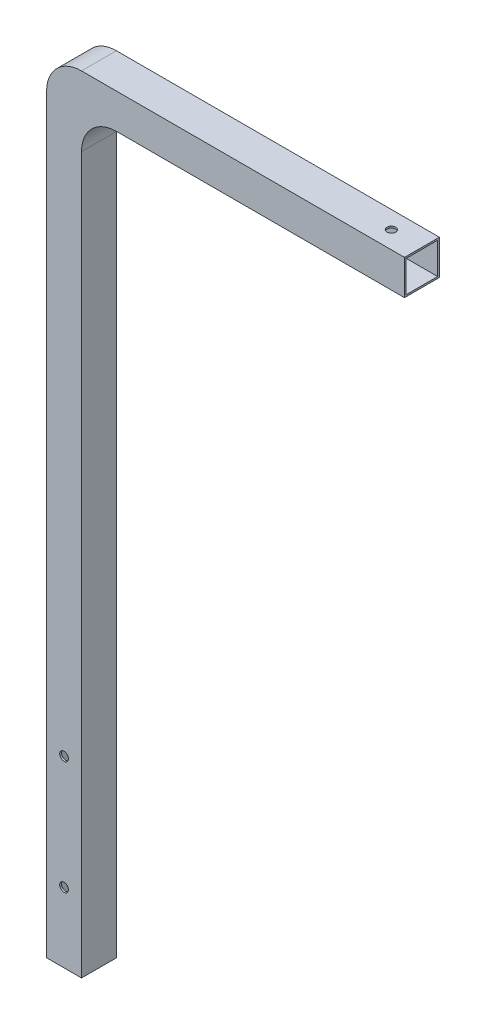
ISO-10303-21;
HEADER;
FILE_DESCRIPTION(('STEP AP214'),'2;1');
FILE_NAME('part.step','',(''),(''),'','','');
FILE_SCHEMA(('AUTOMOTIVE_DESIGN { 1 0 10303 214 1 1 1 1 }'));
ENDSEC;
DATA;
#1=APPLICATION_CONTEXT('core data for automotive mechanical design processes');
#2=APPLICATION_PROTOCOL_DEFINITION('international standard','automotive_design',2000,#1);
#3=PRODUCT_CONTEXT('',#1,'mechanical');
#4=PRODUCT('Part','Part','',(#3));
#5=PRODUCT_RELATED_PRODUCT_CATEGORY('part','',(#4));
#6=PRODUCT_DEFINITION_FORMATION('','',#4);
#7=PRODUCT_DEFINITION_CONTEXT('part definition',#1,'design');
#8=PRODUCT_DEFINITION('design','',#6,#7);
#9=PRODUCT_DEFINITION_SHAPE('','',#8);
#10=(LENGTH_UNIT() NAMED_UNIT(*) SI_UNIT(.MILLI.,.METRE.));
#11=(NAMED_UNIT(*) PLANE_ANGLE_UNIT() SI_UNIT($,.RADIAN.));
#12=(NAMED_UNIT(*) SI_UNIT($,.STERADIAN.) SOLID_ANGLE_UNIT());
#13=UNCERTAINTY_MEASURE_WITH_UNIT(LENGTH_MEASURE(1.E-05),#10,'distance_accuracy_value','');
#14=(GEOMETRIC_REPRESENTATION_CONTEXT(3) GLOBAL_UNCERTAINTY_ASSIGNED_CONTEXT((#13)) GLOBAL_UNIT_ASSIGNED_CONTEXT((#10,
#11,#12)) REPRESENTATION_CONTEXT('',''));
#15=CARTESIAN_POINT('',(0.,0.,0.));
#16=DIRECTION('',(0.,0.,1.));
#17=DIRECTION('',(1.,0.,0.));
#18=AXIS2_PLACEMENT_3D('',#15,#16,#17);
#19=CARTESIAN_POINT('',(520.7,1143.,50.8));
#20=DIRECTION('',(-1.,0.,0.));
#21=DIRECTION('',(0.,0.,1.));
#22=AXIS2_PLACEMENT_3D('',#19,#20,#21);
#23=PLANE('',#22);
#24=DIRECTION('',(0.,1.,0.));
#25=VECTOR('',#24,1.);
#26=CARTESIAN_POINT('',(520.7,1143.,0.));
#27=LINE('',#26,#25);
#28=CARTESIAN_POINT('',(520.7,1092.2,0.));
#29=VERTEX_POINT('',#28);
#30=CARTESIAN_POINT('',(520.7,1143.,0.));
#31=VERTEX_POINT('',#30);
#32=EDGE_CURVE('E281',#29,#31,#27,.T.);
#33=ORIENTED_EDGE('',*,*,#32,.T.);
#34=DIRECTION('',(0.,0.,-1.));
#35=VECTOR('',#34,1.);
#36=CARTESIAN_POINT('',(520.7,1143.,50.8));
#37=LINE('',#36,#35);
#38=CARTESIAN_POINT('',(520.7,1143.,50.8));
#39=VERTEX_POINT('',#38);
#40=EDGE_CURVE('E293',#39,#31,#37,.T.);
#41=ORIENTED_EDGE('',*,*,#40,.F.);
#42=DIRECTION('',(0.,1.,0.));
#43=VECTOR('',#42,1.);
#44=CARTESIAN_POINT('',(520.7,1143.,50.8));
#45=LINE('',#44,#43);
#46=CARTESIAN_POINT('',(520.7,1092.2,50.8));
#47=VERTEX_POINT('',#46);
#48=EDGE_CURVE('E260',#47,#39,#45,.T.);
#49=ORIENTED_EDGE('',*,*,#48,.F.);
#50=DIRECTION('',(0.,0.,-1.));
#51=VECTOR('',#50,1.);
#52=CARTESIAN_POINT('',(520.7,1092.2,50.8));
#53=LINE('',#52,#51);
#54=EDGE_CURVE('E297',#47,#29,#53,.T.);
#55=ORIENTED_EDGE('',*,*,#54,.T.);
#56=EDGE_LOOP('',(#33,#41,#49,#55));
#57=FACE_BOUND('',#56,.T.);
#58=DIRECTION('',(0.,1.,0.));
#59=VECTOR('',#58,1.);
#60=CARTESIAN_POINT('',(520.7,1143.,2.54));
#61=LINE('',#60,#59);
#62=CARTESIAN_POINT('',(520.7,1094.74,2.54));
#63=VERTEX_POINT('',#62);
#64=CARTESIAN_POINT('',(520.7,1140.46,2.54));
#65=VERTEX_POINT('',#64);
#66=EDGE_CURVE('E221',#63,#65,#61,.T.);
#67=ORIENTED_EDGE('',*,*,#66,.F.);
#68=DIRECTION('',(0.,0.,-1.));
#69=VECTOR('',#68,1.);
#70=CARTESIAN_POINT('',(520.7,1094.74,50.8));
#71=LINE('',#70,#69);
#72=CARTESIAN_POINT('',(520.7,1094.74,48.26));
#73=VERTEX_POINT('',#72);
#74=EDGE_CURVE('E218',#73,#63,#71,.T.);
#75=ORIENTED_EDGE('',*,*,#74,.F.);
#76=DIRECTION('',(0.,1.,0.));
#77=VECTOR('',#76,1.);
#78=CARTESIAN_POINT('',(520.7,1143.,48.26));
#79=LINE('',#78,#77);
#80=CARTESIAN_POINT('',(520.7,1140.46,48.26));
#81=VERTEX_POINT('',#80);
#82=EDGE_CURVE('E63',#73,#81,#79,.T.);
#83=ORIENTED_EDGE('',*,*,#82,.T.);
#84=DIRECTION('',(0.,0.,-1.));
#85=VECTOR('',#84,1.);
#86=CARTESIAN_POINT('',(520.7,1140.46,50.8));
#87=LINE('',#86,#85);
#88=EDGE_CURVE('E166',#81,#65,#87,.T.);
#89=ORIENTED_EDGE('',*,*,#88,.T.);
#90=EDGE_LOOP('',(#67,#75,#83,#89));
#91=FACE_BOUND('',#90,.T.);
#92=ADVANCED_FACE('F38',(#57,#91),#23,.F.);
#93=CARTESIAN_POINT('',(0.,0.,50.8));
#94=DIRECTION('',(0.,1.,0.));
#95=DIRECTION('',(0.,0.,1.));
#96=AXIS2_PLACEMENT_3D('',#93,#94,#95);
#97=PLANE('',#96);
#98=DIRECTION('',(-1.,0.,0.));
#99=VECTOR('',#98,1.);
#100=CARTESIAN_POINT('',(48.26,0.,48.26));
#101=LINE('',#100,#99);
#102=CARTESIAN_POINT('',(48.26,0.,48.26));
#103=VERTEX_POINT('',#102);
#104=CARTESIAN_POINT('',(2.54,0.,48.26));
#105=VERTEX_POINT('',#104);
#106=EDGE_CURVE('E170',#103,#105,#101,.T.);
#107=ORIENTED_EDGE('',*,*,#106,.F.);
#108=DIRECTION('',(0.,0.,1.));
#109=VECTOR('',#108,1.);
#110=CARTESIAN_POINT('',(48.26,0.,2.54));
#111=LINE('',#110,#109);
#112=CARTESIAN_POINT('',(48.26,0.,2.54));
#113=VERTEX_POINT('',#112);
#114=EDGE_CURVE('E175',#113,#103,#111,.T.);
#115=ORIENTED_EDGE('',*,*,#114,.F.);
#116=DIRECTION('',(1.,0.,0.));
#117=VECTOR('',#116,1.);
#118=CARTESIAN_POINT('',(2.54,0.,2.54));
#119=LINE('',#118,#117);
#120=CARTESIAN_POINT('',(2.54,0.,2.54));
#121=VERTEX_POINT('',#120);
#122=EDGE_CURVE('E180',#121,#113,#119,.T.);
#123=ORIENTED_EDGE('',*,*,#122,.F.);
#124=DIRECTION('',(0.,0.,-1.));
#125=VECTOR('',#124,1.);
#126=CARTESIAN_POINT('',(2.54,0.,48.26));
#127=LINE('',#126,#125);
#128=EDGE_CURVE('E160',#105,#121,#127,.T.);
#129=ORIENTED_EDGE('',*,*,#128,.F.);
#130=EDGE_LOOP('',(#107,#115,#123,#129));
#131=FACE_BOUND('',#130,.T.);
#132=DIRECTION('',(1.,0.,0.));
#133=VECTOR('',#132,1.);
#134=CARTESIAN_POINT('',(0.,0.,0.));
#135=LINE('',#134,#133);
#136=CARTESIAN_POINT('',(0.,0.,0.));
#137=VERTEX_POINT('',#136);
#138=CARTESIAN_POINT('',(50.8,0.,0.));
#139=VERTEX_POINT('',#138);
#140=EDGE_CURVE('E212',#137,#139,#135,.T.);
#141=ORIENTED_EDGE('',*,*,#140,.T.);
#142=DIRECTION('',(0.,0.,-1.));
#143=VECTOR('',#142,1.);
#144=CARTESIAN_POINT('',(50.8,0.,50.8));
#145=LINE('',#144,#143);
#146=CARTESIAN_POINT('',(50.8,0.,50.8));
#147=VERTEX_POINT('',#146);
#148=EDGE_CURVE('E301',#147,#139,#145,.T.);
#149=ORIENTED_EDGE('',*,*,#148,.F.);
#150=DIRECTION('',(1.,0.,0.));
#151=VECTOR('',#150,1.);
#152=CARTESIAN_POINT('',(0.,0.,50.8));
#153=LINE('',#152,#151);
#154=CARTESIAN_POINT('',(0.,0.,50.8));
#155=VERTEX_POINT('',#154);
#156=EDGE_CURVE('E248',#155,#147,#153,.T.);
#157=ORIENTED_EDGE('',*,*,#156,.F.);
#158=DIRECTION('',(0.,0.,-1.));
#159=VECTOR('',#158,1.);
#160=CARTESIAN_POINT('',(0.,0.,50.8));
#161=LINE('',#160,#159);
#162=EDGE_CURVE('E270',#155,#137,#161,.T.);
#163=ORIENTED_EDGE('',*,*,#162,.T.);
#164=EDGE_LOOP('',(#141,#149,#157,#163));
#165=FACE_BOUND('',#164,.T.);
#166=ADVANCED_FACE('F177',(#131,#165),#97,.F.);
#167=CARTESIAN_POINT('',(50.8,0.,50.8));
#168=DIRECTION('',(-1.,0.,0.));
#169=DIRECTION('',(0.,0.,1.));
#170=AXIS2_PLACEMENT_3D('',#167,#168,#169);
#171=PLANE('',#170);
#172=DIRECTION('',(0.,1.,0.));
#173=VECTOR('',#172,1.);
#174=CARTESIAN_POINT('',(50.8,0.,0.));
#175=LINE('',#174,#173);
#176=CARTESIAN_POINT('',(50.8,1041.4,0.));
#177=VERTEX_POINT('',#176);
#178=EDGE_CURVE('E274',#139,#177,#175,.T.);
#179=ORIENTED_EDGE('',*,*,#178,.T.);
#180=DIRECTION('',(0.,0.,-1.));
#181=VECTOR('',#180,1.);
#182=CARTESIAN_POINT('',(50.8,1041.4,50.8));
#183=LINE('',#182,#181);
#184=CARTESIAN_POINT('',(50.8,1041.4,50.8));
#185=VERTEX_POINT('',#184);
#186=EDGE_CURVE('E309',#177,#185,#183,.F.);
#187=ORIENTED_EDGE('',*,*,#186,.T.);
#188=DIRECTION('',(0.,1.,0.));
#189=VECTOR('',#188,1.);
#190=CARTESIAN_POINT('',(50.8,0.,50.8));
#191=LINE('',#190,#189);
#192=EDGE_CURVE('E252',#147,#185,#191,.T.);
#193=ORIENTED_EDGE('',*,*,#192,.F.);
#194=ORIENTED_EDGE('',*,*,#148,.T.);
#195=EDGE_LOOP('',(#179,#187,#193,#194));
#196=FACE_BOUND('',#195,.T.);
#197=ADVANCED_FACE('F404',(#196),#171,.F.);
#198=CARTESIAN_POINT('',(50.8,1092.2,50.8));
#199=DIRECTION('',(0.,1.,0.));
#200=DIRECTION('',(0.,0.,1.));
#201=AXIS2_PLACEMENT_3D('',#198,#199,#200);
#202=PLANE('',#201);
#203=CARTESIAN_POINT('',(476.25,1092.2,25.4));
#204=DIRECTION('',(0.,1.,0.));
#205=DIRECTION('',(0.,0.,1.));
#206=AXIS2_PLACEMENT_3D('',#203,#204,#205);
#207=CIRCLE('',#206,6.34999999999991);
#208=CARTESIAN_POINT('',(476.25,1092.2,31.7499999999999));
#209=VERTEX_POINT('',#208);
#210=EDGE_CURVE('E362',#209,#209,#207,.T.);
#211=ORIENTED_EDGE('',*,*,#210,.T.);
#212=EDGE_LOOP('',(#211));
#213=FACE_BOUND('',#212,.T.);
#214=DIRECTION('',(1.,0.,0.));
#215=VECTOR('',#214,1.);
#216=CARTESIAN_POINT('',(50.8,1092.2,50.8));
#217=LINE('',#216,#215);
#218=CARTESIAN_POINT('',(101.6,1092.2,50.8));
#219=VERTEX_POINT('',#218);
#220=EDGE_CURVE('E257',#219,#47,#217,.T.);
#221=ORIENTED_EDGE('',*,*,#220,.F.);
#222=DIRECTION('',(0.,0.,-1.));
#223=VECTOR('',#222,1.);
#224=CARTESIAN_POINT('',(101.6,1092.2,0.));
#225=LINE('',#224,#223);
#226=CARTESIAN_POINT('',(101.6,1092.2,0.));
#227=VERTEX_POINT('',#226);
#228=EDGE_CURVE('E305',#219,#227,#225,.T.);
#229=ORIENTED_EDGE('',*,*,#228,.T.);
#230=DIRECTION('',(1.,0.,0.));
#231=VECTOR('',#230,1.);
#232=CARTESIAN_POINT('',(50.8,1092.2,0.));
#233=LINE('',#232,#231);
#234=EDGE_CURVE('E278',#227,#29,#233,.T.);
#235=ORIENTED_EDGE('',*,*,#234,.T.);
#236=ORIENTED_EDGE('',*,*,#54,.F.);
#237=EDGE_LOOP('',(#221,#229,#235,#236));
#238=FACE_BOUND('',#237,.T.);
#239=ADVANCED_FACE('F410',(#213,#238),#202,.F.);
#240=CARTESIAN_POINT('',(0.,1143.,50.8));
#241=DIRECTION('',(0.,-1.,0.));
#242=DIRECTION('',(0.,0.,-1.));
#243=AXIS2_PLACEMENT_3D('',#240,#241,#242);
#244=PLANE('',#243);
#245=CARTESIAN_POINT('',(476.25,1143.,25.4));
#246=DIRECTION('',(0.,1.,0.));
#247=DIRECTION('',(0.,0.,1.));
#248=AXIS2_PLACEMENT_3D('',#245,#246,#247);
#249=CIRCLE('',#248,6.34999999999997);
#250=CARTESIAN_POINT('',(476.25,1143.,31.75));
#251=VERTEX_POINT('',#250);
#252=EDGE_CURVE('E331',#251,#251,#249,.T.);
#253=ORIENTED_EDGE('',*,*,#252,.F.);
#254=EDGE_LOOP('',(#253));
#255=FACE_BOUND('',#254,.T.);
#256=DIRECTION('',(-1.,0.,0.));
#257=VECTOR('',#256,1.);
#258=CARTESIAN_POINT('',(0.,1143.,0.));
#259=LINE('',#258,#257);
#260=CARTESIAN_POINT('',(50.8,1143.,0.));
#261=VERTEX_POINT('',#260);
#262=EDGE_CURVE('E284',#31,#261,#259,.T.);
#263=ORIENTED_EDGE('',*,*,#262,.T.);
#264=DIRECTION('',(0.,0.,-1.));
#265=VECTOR('',#264,1.);
#266=CARTESIAN_POINT('',(50.8,1143.,50.8));
#267=LINE('',#266,#265);
#268=CARTESIAN_POINT('',(50.8,1143.,50.8));
#269=VERTEX_POINT('',#268);
#270=EDGE_CURVE('E319',#261,#269,#267,.F.);
#271=ORIENTED_EDGE('',*,*,#270,.T.);
#272=DIRECTION('',(-1.,0.,0.));
#273=VECTOR('',#272,1.);
#274=CARTESIAN_POINT('',(0.,1143.,50.8));
#275=LINE('',#274,#273);
#276=EDGE_CURVE('E263',#39,#269,#275,.T.);
#277=ORIENTED_EDGE('',*,*,#276,.F.);
#278=ORIENTED_EDGE('',*,*,#40,.T.);
#279=EDGE_LOOP('',(#263,#271,#277,#278));
#280=FACE_BOUND('',#279,.T.);
#281=ADVANCED_FACE('F408',(#255,#280),#244,.F.);
#282=CARTESIAN_POINT('',(0.,0.,50.8));
#283=DIRECTION('',(1.,0.,0.));
#284=DIRECTION('',(0.,0.,-1.));
#285=AXIS2_PLACEMENT_3D('',#282,#283,#284);
#286=PLANE('',#285);
#287=DIRECTION('',(0.,-1.,0.));
#288=VECTOR('',#287,1.);
#289=CARTESIAN_POINT('',(0.,0.,50.8));
#290=LINE('',#289,#288);
#291=CARTESIAN_POINT('',(0.,1092.2,50.8));
#292=VERTEX_POINT('',#291);
#293=EDGE_CURVE('E267',#292,#155,#290,.T.);
#294=ORIENTED_EDGE('',*,*,#293,.F.);
#295=DIRECTION('',(0.,0.,-1.));
#296=VECTOR('',#295,1.);
#297=CARTESIAN_POINT('',(0.,1092.2,50.8));
#298=LINE('',#297,#296);
#299=CARTESIAN_POINT('',(0.,1092.2,0.));
#300=VERTEX_POINT('',#299);
#301=EDGE_CURVE('E312',#292,#300,#298,.T.);
#302=ORIENTED_EDGE('',*,*,#301,.T.);
#303=DIRECTION('',(0.,-1.,0.));
#304=VECTOR('',#303,1.);
#305=CARTESIAN_POINT('',(0.,0.,0.));
#306=LINE('',#305,#304);
#307=EDGE_CURVE('E253',#300,#137,#306,.T.);
#308=ORIENTED_EDGE('',*,*,#307,.T.);
#309=ORIENTED_EDGE('',*,*,#162,.F.);
#310=EDGE_LOOP('',(#294,#302,#308,#309));
#311=FACE_BOUND('',#310,.T.);
#312=ADVANCED_FACE('F447',(#311),#286,.F.);
#313=CARTESIAN_POINT('',(0.,0.,50.8));
#314=DIRECTION('',(0.,0.,1.));
#315=DIRECTION('',(1.,0.,0.));
#316=AXIS2_PLACEMENT_3D('',#313,#314,#315);
#317=PLANE('',#316);
#318=CARTESIAN_POINT('',(25.4,101.6,50.8));
#319=DIRECTION('',(0.,0.,1.));
#320=DIRECTION('',(1.,0.,0.));
#321=AXIS2_PLACEMENT_3D('',#318,#319,#320);
#322=CIRCLE('',#321,6.34999999999999);
#323=CARTESIAN_POINT('',(31.75,101.6,50.8));
#324=VERTEX_POINT('',#323);
#325=EDGE_CURVE('E691',#324,#324,#322,.T.);
#326=ORIENTED_EDGE('',*,*,#325,.F.);
#327=EDGE_LOOP('',(#326));
#328=FACE_BOUND('',#327,.T.);
#329=CARTESIAN_POINT('',(25.4,266.7,50.8));
#330=DIRECTION('',(0.,0.,1.));
#331=DIRECTION('',(1.,0.,0.));
#332=AXIS2_PLACEMENT_3D('',#329,#330,#331);
#333=CIRCLE('',#332,6.34999999999999);
#334=CARTESIAN_POINT('',(31.75,266.7,50.8));
#335=VERTEX_POINT('',#334);
#336=EDGE_CURVE('E345',#335,#335,#333,.T.);
#337=ORIENTED_EDGE('',*,*,#336,.F.);
#338=EDGE_LOOP('',(#337));
#339=FACE_BOUND('',#338,.T.);
#340=ORIENTED_EDGE('',*,*,#276,.T.);
#341=CARTESIAN_POINT('',(50.8,1092.2,50.8));
#342=DIRECTION('',(0.,0.,1.));
#343=DIRECTION('',(1.,0.,0.));
#344=AXIS2_PLACEMENT_3D('',#341,#342,#343);
#345=CIRCLE('',#344,50.8);
#346=EDGE_CURVE('E322',#269,#292,#345,.T.);
#347=ORIENTED_EDGE('',*,*,#346,.T.);
#348=ORIENTED_EDGE('',*,*,#293,.T.);
#349=ORIENTED_EDGE('',*,*,#156,.T.);
#350=ORIENTED_EDGE('',*,*,#192,.T.);
#351=CARTESIAN_POINT('',(101.6,1041.4,50.8));
#352=DIRECTION('',(0.,0.,1.));
#353=DIRECTION('',(1.,0.,0.));
#354=AXIS2_PLACEMENT_3D('',#351,#352,#353);
#355=CIRCLE('',#354,50.8);
#356=EDGE_CURVE('E11',#185,#219,#355,.F.);
#357=ORIENTED_EDGE('',*,*,#356,.T.);
#358=ORIENTED_EDGE('',*,*,#220,.T.);
#359=ORIENTED_EDGE('',*,*,#48,.T.);
#360=EDGE_LOOP('',(#340,#347,#348,#349,#350,#357,#358,#359));
#361=FACE_BOUND('',#360,.T.);
#362=ADVANCED_FACE('F425',(#328,#339,#361),#317,.T.);
#363=CARTESIAN_POINT('',(0.,0.,0.));
#364=DIRECTION('',(0.,0.,1.));
#365=DIRECTION('',(1.,0.,0.));
#366=AXIS2_PLACEMENT_3D('',#363,#364,#365);
#367=PLANE('',#366);
#368=CARTESIAN_POINT('',(25.4,101.6,0.));
#369=DIRECTION('',(0.,0.,1.));
#370=DIRECTION('',(1.,0.,0.));
#371=AXIS2_PLACEMENT_3D('',#368,#369,#370);
#372=CIRCLE('',#371,6.34999999999999);
#373=CARTESIAN_POINT('',(31.75,101.6,0.));
#374=VERTEX_POINT('',#373);
#375=EDGE_CURVE('E697',#374,#374,#372,.T.);
#376=ORIENTED_EDGE('',*,*,#375,.T.);
#377=EDGE_LOOP('',(#376));
#378=FACE_BOUND('',#377,.T.);
#379=CARTESIAN_POINT('',(25.4,266.7,0.));
#380=DIRECTION('',(0.,0.,1.));
#381=DIRECTION('',(1.,0.,0.));
#382=AXIS2_PLACEMENT_3D('',#379,#380,#381);
#383=CIRCLE('',#382,6.34999999999999);
#384=CARTESIAN_POINT('',(31.75,266.7,0.));
#385=VERTEX_POINT('',#384);
#386=EDGE_CURVE('E336',#385,#385,#383,.T.);
#387=ORIENTED_EDGE('',*,*,#386,.T.);
#388=EDGE_LOOP('',(#387));
#389=FACE_BOUND('',#388,.T.);
#390=ORIENTED_EDGE('',*,*,#307,.F.);
#391=CARTESIAN_POINT('',(50.8,1092.2,0.));
#392=DIRECTION('',(0.,0.,1.));
#393=DIRECTION('',(1.,0.,0.));
#394=AXIS2_PLACEMENT_3D('',#391,#392,#393);
#395=CIRCLE('',#394,50.8);
#396=EDGE_CURVE('E316',#300,#261,#395,.F.);
#397=ORIENTED_EDGE('',*,*,#396,.T.);
#398=ORIENTED_EDGE('',*,*,#262,.F.);
#399=ORIENTED_EDGE('',*,*,#32,.F.);
#400=ORIENTED_EDGE('',*,*,#234,.F.);
#401=CARTESIAN_POINT('',(101.6,1041.4,0.));
#402=DIRECTION('',(0.,0.,1.));
#403=DIRECTION('',(1.,0.,0.));
#404=AXIS2_PLACEMENT_3D('',#401,#402,#403);
#405=CIRCLE('',#404,50.8);
#406=EDGE_CURVE('E48',#227,#177,#405,.T.);
#407=ORIENTED_EDGE('',*,*,#406,.T.);
#408=ORIENTED_EDGE('',*,*,#178,.F.);
#409=ORIENTED_EDGE('',*,*,#140,.F.);
#410=EDGE_LOOP('',(#390,#397,#398,#399,#400,#407,#408,#409));
#411=FACE_BOUND('',#410,.T.);
#412=ADVANCED_FACE('F418',(#378,#389,#411),#367,.F.);
#413=CARTESIAN_POINT('',(101.6,1041.4,50.8));
#414=DIRECTION('',(0.,0.,1.));
#415=DIRECTION('',(1.,0.,0.));
#416=AXIS2_PLACEMENT_3D('',#413,#414,#415);
#417=CYLINDRICAL_SURFACE('',#416,50.8);
#418=ORIENTED_EDGE('',*,*,#356,.F.);
#419=ORIENTED_EDGE('',*,*,#186,.F.);
#420=ORIENTED_EDGE('',*,*,#406,.F.);
#421=ORIENTED_EDGE('',*,*,#228,.F.);
#422=EDGE_LOOP('',(#418,#419,#420,#421));
#423=FACE_BOUND('',#422,.T.);
#424=ADVANCED_FACE('F416',(#423),#417,.F.);
#425=CARTESIAN_POINT('',(50.8,1092.2,50.8));
#426=DIRECTION('',(0.,0.,-1.));
#427=DIRECTION('',(-1.,0.,0.));
#428=AXIS2_PLACEMENT_3D('',#425,#426,#427);
#429=CYLINDRICAL_SURFACE('',#428,50.8);
#430=ORIENTED_EDGE('',*,*,#346,.F.);
#431=ORIENTED_EDGE('',*,*,#270,.F.);
#432=ORIENTED_EDGE('',*,*,#396,.F.);
#433=ORIENTED_EDGE('',*,*,#301,.F.);
#434=EDGE_LOOP('',(#430,#431,#432,#433));
#435=FACE_BOUND('',#434,.T.);
#436=ADVANCED_FACE('F40',(#435),#429,.T.);
#437=CARTESIAN_POINT('',(48.26,0.,50.8));
#438=DIRECTION('',(-1.,0.,0.));
#439=DIRECTION('',(0.,0.,1.));
#440=AXIS2_PLACEMENT_3D('',#437,#438,#439);
#441=PLANE('',#440);
#442=DIRECTION('',(0.,1.,0.));
#443=VECTOR('',#442,1.);
#444=CARTESIAN_POINT('',(48.26,0.,48.26));
#445=LINE('',#444,#443);
#446=CARTESIAN_POINT('',(48.26,1041.4,48.26));
#447=VERTEX_POINT('',#446);
#448=EDGE_CURVE('E56',#103,#447,#445,.T.);
#449=ORIENTED_EDGE('',*,*,#448,.T.);
#450=DIRECTION('',(0.,0.,1.));
#451=VECTOR('',#450,1.);
#452=CARTESIAN_POINT('',(48.26,1041.4,50.8));
#453=LINE('',#452,#451);
#454=CARTESIAN_POINT('',(48.26,1041.4,2.54));
#455=VERTEX_POINT('',#454);
#456=EDGE_CURVE('E192',#455,#447,#453,.T.);
#457=ORIENTED_EDGE('',*,*,#456,.F.);
#458=DIRECTION('',(0.,1.,0.));
#459=VECTOR('',#458,1.);
#460=CARTESIAN_POINT('',(48.26,0.,2.54));
#461=LINE('',#460,#459);
#462=EDGE_CURVE('E185',#113,#455,#461,.T.);
#463=ORIENTED_EDGE('',*,*,#462,.F.);
#464=ORIENTED_EDGE('',*,*,#114,.T.);
#465=EDGE_LOOP('',(#449,#457,#463,#464));
#466=FACE_BOUND('',#465,.T.);
#467=ADVANCED_FACE('F368',(#466),#441,.T.);
#468=CARTESIAN_POINT('',(50.8,1094.74,50.8));
#469=DIRECTION('',(0.,1.,0.));
#470=DIRECTION('',(0.,0.,1.));
#471=AXIS2_PLACEMENT_3D('',#468,#469,#470);
#472=PLANE('',#471);
#473=CARTESIAN_POINT('',(476.25,1094.74,25.4));
#474=DIRECTION('',(0.,1.,0.));
#475=DIRECTION('',(0.,0.,1.));
#476=AXIS2_PLACEMENT_3D('',#473,#474,#475);
#477=CIRCLE('',#476,6.34999999999991);
#478=CARTESIAN_POINT('',(476.25,1094.74,31.7499999999999));
#479=VERTEX_POINT('',#478);
#480=EDGE_CURVE('E330',#479,#479,#477,.T.);
#481=ORIENTED_EDGE('',*,*,#480,.F.);
#482=EDGE_LOOP('',(#481));
#483=FACE_BOUND('',#482,.T.);
#484=DIRECTION('',(1.,0.,0.));
#485=VECTOR('',#484,1.);
#486=CARTESIAN_POINT('',(50.8,1094.74,48.26));
#487=LINE('',#486,#485);
#488=CARTESIAN_POINT('',(101.6,1094.74,48.26));
#489=VERTEX_POINT('',#488);
#490=EDGE_CURVE('E199',#489,#73,#487,.T.);
#491=ORIENTED_EDGE('',*,*,#490,.T.);
#492=ORIENTED_EDGE('',*,*,#74,.T.);
#493=DIRECTION('',(1.,0.,0.));
#494=VECTOR('',#493,1.);
#495=CARTESIAN_POINT('',(50.8,1094.74,2.54));
#496=LINE('',#495,#494);
#497=CARTESIAN_POINT('',(101.6,1094.74,2.54));
#498=VERTEX_POINT('',#497);
#499=EDGE_CURVE('E191',#498,#63,#496,.T.);
#500=ORIENTED_EDGE('',*,*,#499,.F.);
#501=DIRECTION('',(0.,0.,1.));
#502=VECTOR('',#501,1.);
#503=CARTESIAN_POINT('',(101.6,1094.74,50.8));
#504=LINE('',#503,#502);
#505=EDGE_CURVE('E196',#489,#498,#504,.F.);
#506=ORIENTED_EDGE('',*,*,#505,.F.);
#507=EDGE_LOOP('',(#491,#492,#500,#506));
#508=FACE_BOUND('',#507,.T.);
#509=ADVANCED_FACE('F382',(#483,#508),#472,.T.);
#510=CARTESIAN_POINT('',(0.,1140.46,50.8));
#511=DIRECTION('',(0.,-1.,0.));
#512=DIRECTION('',(0.,0.,-1.));
#513=AXIS2_PLACEMENT_3D('',#510,#511,#512);
#514=PLANE('',#513);
#515=CARTESIAN_POINT('',(476.25,1140.46,25.4));
#516=DIRECTION('',(0.,-1.,0.));
#517=DIRECTION('',(0.,0.,-1.));
#518=AXIS2_PLACEMENT_3D('',#515,#516,#517);
#519=CIRCLE('',#518,6.34999999999991);
#520=CARTESIAN_POINT('',(476.25,1140.46,19.0500000000001));
#521=VERTEX_POINT('',#520);
#522=EDGE_CURVE('E327',#521,#521,#519,.T.);
#523=ORIENTED_EDGE('',*,*,#522,.F.);
#524=EDGE_LOOP('',(#523));
#525=FACE_BOUND('',#524,.T.);
#526=DIRECTION('',(-1.,0.,0.));
#527=VECTOR('',#526,1.);
#528=CARTESIAN_POINT('',(0.,1140.46,2.54));
#529=LINE('',#528,#527);
#530=CARTESIAN_POINT('',(50.8,1140.46,2.54));
#531=VERTEX_POINT('',#530);
#532=EDGE_CURVE('E224',#65,#531,#529,.T.);
#533=ORIENTED_EDGE('',*,*,#532,.F.);
#534=ORIENTED_EDGE('',*,*,#88,.F.);
#535=DIRECTION('',(-1.,0.,0.));
#536=VECTOR('',#535,1.);
#537=CARTESIAN_POINT('',(0.,1140.46,48.26));
#538=LINE('',#537,#536);
#539=CARTESIAN_POINT('',(50.8,1140.46,48.26));
#540=VERTEX_POINT('',#539);
#541=EDGE_CURVE('E167',#81,#540,#538,.T.);
#542=ORIENTED_EDGE('',*,*,#541,.T.);
#543=DIRECTION('',(0.,0.,-1.));
#544=VECTOR('',#543,1.);
#545=CARTESIAN_POINT('',(50.8,1140.46,50.8));
#546=LINE('',#545,#544);
#547=EDGE_CURVE('E207',#531,#540,#546,.F.);
#548=ORIENTED_EDGE('',*,*,#547,.F.);
#549=EDGE_LOOP('',(#533,#534,#542,#548));
#550=FACE_BOUND('',#549,.T.);
#551=ADVANCED_FACE('F386',(#525,#550),#514,.T.);
#552=CARTESIAN_POINT('',(2.54,0.,50.8));
#553=DIRECTION('',(1.,0.,0.));
#554=DIRECTION('',(0.,0.,-1.));
#555=AXIS2_PLACEMENT_3D('',#552,#553,#554);
#556=PLANE('',#555);
#557=ORIENTED_EDGE('',*,*,#128,.T.);
#558=DIRECTION('',(0.,-1.,0.));
#559=VECTOR('',#558,1.);
#560=CARTESIAN_POINT('',(2.54,0.,2.54));
#561=LINE('',#560,#559);
#562=CARTESIAN_POINT('',(2.54,1092.2,2.54));
#563=VERTEX_POINT('',#562);
#564=EDGE_CURVE('E200',#563,#121,#561,.T.);
#565=ORIENTED_EDGE('',*,*,#564,.F.);
#566=DIRECTION('',(0.,0.,-1.));
#567=VECTOR('',#566,1.);
#568=CARTESIAN_POINT('',(2.54,1092.2,50.8));
#569=LINE('',#568,#567);
#570=CARTESIAN_POINT('',(2.54,1092.2,48.26));
#571=VERTEX_POINT('',#570);
#572=EDGE_CURVE('E163',#571,#563,#569,.T.);
#573=ORIENTED_EDGE('',*,*,#572,.F.);
#574=DIRECTION('',(0.,-1.,0.));
#575=VECTOR('',#574,1.);
#576=CARTESIAN_POINT('',(2.54,0.,48.26));
#577=LINE('',#576,#575);
#578=EDGE_CURVE('E156',#571,#105,#577,.T.);
#579=ORIENTED_EDGE('',*,*,#578,.T.);
#580=EDGE_LOOP('',(#557,#565,#573,#579));
#581=FACE_BOUND('',#580,.T.);
#582=ADVANCED_FACE('F157',(#581),#556,.T.);
#583=CARTESIAN_POINT('',(0.,0.,48.26));
#584=DIRECTION('',(0.,0.,1.));
#585=DIRECTION('',(1.,0.,0.));
#586=AXIS2_PLACEMENT_3D('',#583,#584,#585);
#587=PLANE('',#586);
#588=CARTESIAN_POINT('',(25.4,101.6,48.26));
#589=DIRECTION('',(0.,0.,1.));
#590=DIRECTION('',(1.,0.,0.));
#591=AXIS2_PLACEMENT_3D('',#588,#589,#590);
#592=CIRCLE('',#591,6.34999999999999);
#593=CARTESIAN_POINT('',(31.75,101.6,48.26));
#594=VERTEX_POINT('',#593);
#595=EDGE_CURVE('E352',#594,#594,#592,.T.);
#596=ORIENTED_EDGE('',*,*,#595,.T.);
#597=EDGE_LOOP('',(#596));
#598=FACE_BOUND('',#597,.T.);
#599=CARTESIAN_POINT('',(25.4,266.7,48.26));
#600=DIRECTION('',(0.,0.,1.));
#601=DIRECTION('',(1.,0.,0.));
#602=AXIS2_PLACEMENT_3D('',#599,#600,#601);
#603=CIRCLE('',#602,6.34999999999999);
#604=CARTESIAN_POINT('',(31.75,266.7,48.26));
#605=VERTEX_POINT('',#604);
#606=EDGE_CURVE('E335',#605,#605,#603,.T.);
#607=ORIENTED_EDGE('',*,*,#606,.T.);
#608=EDGE_LOOP('',(#607));
#609=FACE_BOUND('',#608,.T.);
#610=ORIENTED_EDGE('',*,*,#106,.T.);
#611=ORIENTED_EDGE('',*,*,#578,.F.);
#612=CARTESIAN_POINT('',(50.8,1092.2,48.26));
#613=DIRECTION('',(0.,0.,1.));
#614=DIRECTION('',(1.,0.,0.));
#615=AXIS2_PLACEMENT_3D('',#612,#613,#614);
#616=CIRCLE('',#615,48.26);
#617=EDGE_CURVE('E204',#540,#571,#616,.T.);
#618=ORIENTED_EDGE('',*,*,#617,.F.);
#619=ORIENTED_EDGE('',*,*,#541,.F.);
#620=ORIENTED_EDGE('',*,*,#82,.F.);
#621=ORIENTED_EDGE('',*,*,#490,.F.);
#622=CARTESIAN_POINT('',(101.6,1041.4,48.26));
#623=DIRECTION('',(0.,0.,1.));
#624=DIRECTION('',(1.,0.,0.));
#625=AXIS2_PLACEMENT_3D('',#622,#623,#624);
#626=CIRCLE('',#625,53.34);
#627=EDGE_CURVE('E209',#447,#489,#626,.F.);
#628=ORIENTED_EDGE('',*,*,#627,.F.);
#629=ORIENTED_EDGE('',*,*,#448,.F.);
#630=EDGE_LOOP('',(#610,#611,#618,#619,#620,#621,#628,#629));
#631=FACE_BOUND('',#630,.T.);
#632=ADVANCED_FACE('F171',(#598,#609,#631),#587,.F.);
#633=CARTESIAN_POINT('',(0.,0.,2.54));
#634=DIRECTION('',(0.,0.,1.));
#635=DIRECTION('',(1.,0.,0.));
#636=AXIS2_PLACEMENT_3D('',#633,#634,#635);
#637=PLANE('',#636);
#638=CARTESIAN_POINT('',(25.4,101.6,2.54));
#639=DIRECTION('',(0.,0.,1.));
#640=DIRECTION('',(1.,0.,0.));
#641=AXIS2_PLACEMENT_3D('',#638,#639,#640);
#642=CIRCLE('',#641,6.34999999999999);
#643=CARTESIAN_POINT('',(31.75,101.6,2.54));
#644=VERTEX_POINT('',#643);
#645=EDGE_CURVE('E42',#644,#644,#642,.T.);
#646=ORIENTED_EDGE('',*,*,#645,.F.);
#647=EDGE_LOOP('',(#646));
#648=FACE_BOUND('',#647,.T.);
#649=CARTESIAN_POINT('',(25.4,266.7,2.54));
#650=DIRECTION('',(0.,0.,1.));
#651=DIRECTION('',(1.,0.,0.));
#652=AXIS2_PLACEMENT_3D('',#649,#650,#651);
#653=CIRCLE('',#652,6.34999999999999);
#654=CARTESIAN_POINT('',(31.75,266.7,2.54));
#655=VERTEX_POINT('',#654);
#656=EDGE_CURVE('E332',#655,#655,#653,.T.);
#657=ORIENTED_EDGE('',*,*,#656,.F.);
#658=EDGE_LOOP('',(#657));
#659=FACE_BOUND('',#658,.T.);
#660=ORIENTED_EDGE('',*,*,#462,.T.);
#661=CARTESIAN_POINT('',(101.6,1041.4,2.54));
#662=DIRECTION('',(0.,0.,1.));
#663=DIRECTION('',(1.,0.,0.));
#664=AXIS2_PLACEMENT_3D('',#661,#662,#663);
#665=CIRCLE('',#664,53.34);
#666=EDGE_CURVE('E206',#498,#455,#665,.T.);
#667=ORIENTED_EDGE('',*,*,#666,.F.);
#668=ORIENTED_EDGE('',*,*,#499,.T.);
#669=ORIENTED_EDGE('',*,*,#66,.T.);
#670=ORIENTED_EDGE('',*,*,#532,.T.);
#671=CARTESIAN_POINT('',(50.8,1092.2,2.54));
#672=DIRECTION('',(0.,0.,1.));
#673=DIRECTION('',(1.,0.,0.));
#674=AXIS2_PLACEMENT_3D('',#671,#672,#673);
#675=CIRCLE('',#674,48.26);
#676=EDGE_CURVE('E225',#563,#531,#675,.F.);
#677=ORIENTED_EDGE('',*,*,#676,.F.);
#678=ORIENTED_EDGE('',*,*,#564,.T.);
#679=ORIENTED_EDGE('',*,*,#122,.T.);
#680=EDGE_LOOP('',(#660,#667,#668,#669,#670,#677,#678,#679));
#681=FACE_BOUND('',#680,.T.);
#682=ADVANCED_FACE('F371',(#648,#659,#681),#637,.T.);
#683=CARTESIAN_POINT('',(101.6,1041.4,50.8));
#684=DIRECTION('',(0.,0.,1.));
#685=DIRECTION('',(1.,0.,0.));
#686=AXIS2_PLACEMENT_3D('',#683,#684,#685);
#687=CYLINDRICAL_SURFACE('',#686,53.34);
#688=ORIENTED_EDGE('',*,*,#627,.T.);
#689=ORIENTED_EDGE('',*,*,#505,.T.);
#690=ORIENTED_EDGE('',*,*,#666,.T.);
#691=ORIENTED_EDGE('',*,*,#456,.T.);
#692=EDGE_LOOP('',(#688,#689,#690,#691));
#693=FACE_BOUND('',#692,.T.);
#694=ADVANCED_FACE('F385',(#693),#687,.T.);
#695=CARTESIAN_POINT('',(50.8,1092.2,50.8));
#696=DIRECTION('',(0.,0.,-1.));
#697=DIRECTION('',(-1.,0.,0.));
#698=AXIS2_PLACEMENT_3D('',#695,#696,#697);
#699=CYLINDRICAL_SURFACE('',#698,48.26);
#700=ORIENTED_EDGE('',*,*,#617,.T.);
#701=ORIENTED_EDGE('',*,*,#572,.T.);
#702=ORIENTED_EDGE('',*,*,#676,.T.);
#703=ORIENTED_EDGE('',*,*,#547,.T.);
#704=EDGE_LOOP('',(#700,#701,#702,#703));
#705=FACE_BOUND('',#704,.T.);
#706=ADVANCED_FACE('F375',(#705),#699,.F.);
#707=CARTESIAN_POINT('',(476.25,1143.,25.4));
#708=DIRECTION('',(0.,1.,0.));
#709=DIRECTION('',(0.,0.,1.));
#710=AXIS2_PLACEMENT_3D('',#707,#708,#709);
#711=CYLINDRICAL_SURFACE('',#710,6.34999999999991);
#712=ORIENTED_EDGE('',*,*,#522,.T.);
#713=EDGE_LOOP('',(#712));
#714=FACE_BOUND('',#713,.T.);
#715=ORIENTED_EDGE('',*,*,#252,.T.);
#716=EDGE_LOOP('',(#715));
#717=FACE_BOUND('',#716,.T.);
#718=ADVANCED_FACE('F461',(#714,#717),#711,.F.);
#719=ORIENTED_EDGE('',*,*,#480,.T.);
#720=EDGE_LOOP('',(#719));
#721=FACE_BOUND('',#720,.T.);
#722=ORIENTED_EDGE('',*,*,#210,.F.);
#723=EDGE_LOOP('',(#722));
#724=FACE_BOUND('',#723,.T.);
#725=ADVANCED_FACE('F463',(#721,#724),#711,.F.);
#726=CARTESIAN_POINT('',(25.4,266.7,50.8));
#727=DIRECTION('',(0.,0.,1.));
#728=DIRECTION('',(1.,0.,0.));
#729=AXIS2_PLACEMENT_3D('',#726,#727,#728);
#730=CYLINDRICAL_SURFACE('',#729,6.34999999999999);
#731=ORIENTED_EDGE('',*,*,#656,.T.);
#732=EDGE_LOOP('',(#731));
#733=FACE_BOUND('',#732,.T.);
#734=ORIENTED_EDGE('',*,*,#386,.F.);
#735=EDGE_LOOP('',(#734));
#736=FACE_BOUND('',#735,.T.);
#737=ADVANCED_FACE('F470',(#733,#736),#730,.F.);
#738=ORIENTED_EDGE('',*,*,#336,.T.);
#739=EDGE_LOOP('',(#738));
#740=FACE_BOUND('',#739,.T.);
#741=ORIENTED_EDGE('',*,*,#606,.F.);
#742=EDGE_LOOP('',(#741));
#743=FACE_BOUND('',#742,.T.);
#744=ADVANCED_FACE('F552',(#740,#743),#730,.F.);
#745=CARTESIAN_POINT('',(25.4,101.6,50.8));
#746=DIRECTION('',(0.,0.,1.));
#747=DIRECTION('',(1.,0.,0.));
#748=AXIS2_PLACEMENT_3D('',#745,#746,#747);
#749=CYLINDRICAL_SURFACE('',#748,6.34999999999999);
#750=ORIENTED_EDGE('',*,*,#645,.T.);
#751=EDGE_LOOP('',(#750));
#752=FACE_BOUND('',#751,.T.);
#753=ORIENTED_EDGE('',*,*,#375,.F.);
#754=EDGE_LOOP('',(#753));
#755=FACE_BOUND('',#754,.T.);
#756=ADVANCED_FACE('F560',(#752,#755),#749,.F.);
#757=ORIENTED_EDGE('',*,*,#325,.T.);
#758=EDGE_LOOP('',(#757));
#759=FACE_BOUND('',#758,.T.);
#760=ORIENTED_EDGE('',*,*,#595,.F.);
#761=EDGE_LOOP('',(#760));
#762=FACE_BOUND('',#761,.T.);
#763=ADVANCED_FACE('F569',(#759,#762),#749,.F.);
#764=CLOSED_SHELL('',(#92,#166,#197,#239,#281,#312,#362,#412,#424,#436,#467,#509,#551,#582,#632,
#682,#694,#706,#718,#725,#737,#744,#756,#763));
#765=MANIFOLD_SOLID_BREP('B2',#764);
#766=ADVANCED_BREP_SHAPE_REPRESENTATION('',(#18,#765),#14);
#767=SHAPE_DEFINITION_REPRESENTATION(#9,#766);
ENDSEC;
END-ISO-10303-21;
